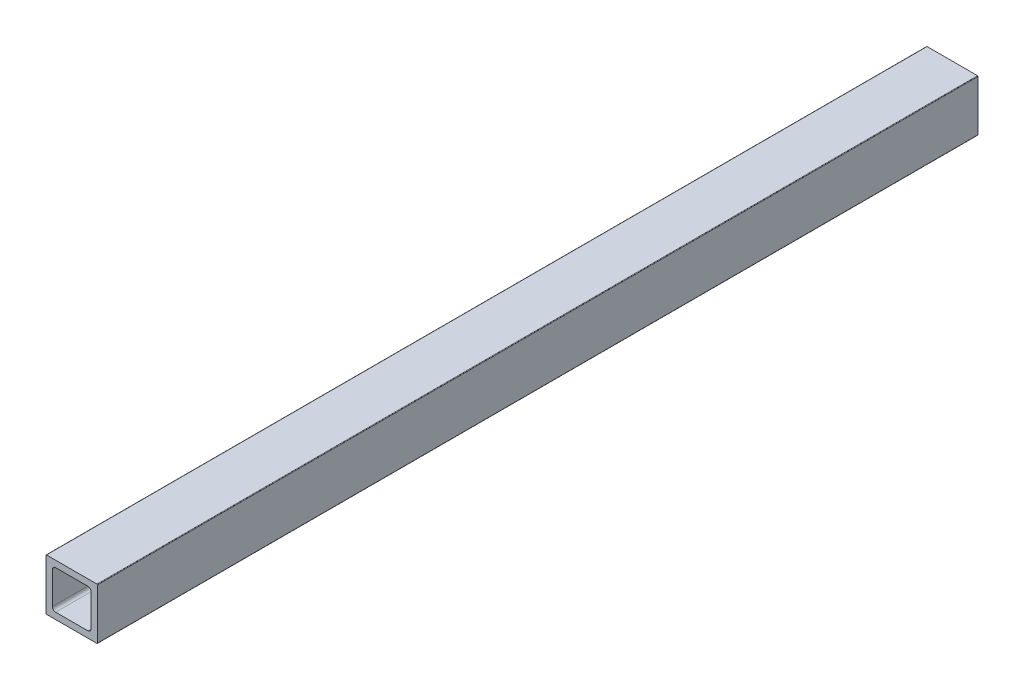
ISO-10303-21;
HEADER;
FILE_DESCRIPTION(('STEP AP214'),'2;1');
FILE_NAME('part.step','',(''),(''),'','','');
FILE_SCHEMA(('AUTOMOTIVE_DESIGN { 1 0 10303 214 1 1 1 1 }'));
ENDSEC;
DATA;
#1=APPLICATION_CONTEXT('core data for automotive mechanical design processes');
#2=APPLICATION_PROTOCOL_DEFINITION('international standard','automotive_design',2000,#1);
#3=PRODUCT_CONTEXT('',#1,'mechanical');
#4=PRODUCT('Part','Part','',(#3));
#5=PRODUCT_RELATED_PRODUCT_CATEGORY('part','',(#4));
#6=PRODUCT_DEFINITION_FORMATION('','',#4);
#7=PRODUCT_DEFINITION_CONTEXT('part definition',#1,'design');
#8=PRODUCT_DEFINITION('design','',#6,#7);
#9=PRODUCT_DEFINITION_SHAPE('','',#8);
#10=(LENGTH_UNIT() NAMED_UNIT(*) SI_UNIT(.MILLI.,.METRE.));
#11=(NAMED_UNIT(*) PLANE_ANGLE_UNIT() SI_UNIT($,.RADIAN.));
#12=(NAMED_UNIT(*) SI_UNIT($,.STERADIAN.) SOLID_ANGLE_UNIT());
#13=UNCERTAINTY_MEASURE_WITH_UNIT(LENGTH_MEASURE(1.E-05),#10,'distance_accuracy_value','');
#14=(GEOMETRIC_REPRESENTATION_CONTEXT(3) GLOBAL_UNCERTAINTY_ASSIGNED_CONTEXT((#13)) GLOBAL_UNIT_ASSIGNED_CONTEXT((#10,
#11,#12)) REPRESENTATION_CONTEXT('',''));
#15=CARTESIAN_POINT('',(0.,0.,0.));
#16=DIRECTION('',(0.,0.,1.));
#17=DIRECTION('',(1.,0.,0.));
#18=AXIS2_PLACEMENT_3D('',#15,#16,#17);
#19=CARTESIAN_POINT('',(0.254,0.254,0.));
#20=DIRECTION('',(0.,0.,-1.));
#21=DIRECTION('',(0.,-1.,0.));
#22=AXIS2_PLACEMENT_3D('',#19,#20,#21);
#23=PLANE('',#22);
#24=CARTESIAN_POINT('',(0.254,0.254,0.));
#25=DIRECTION('',(0.,0.,1.));
#26=DIRECTION('',(-1.,0.,0.));
#27=AXIS2_PLACEMENT_3D('',#24,#25,#26);
#28=CIRCLE('',#27,0.254);
#29=CARTESIAN_POINT('',(0.,0.254,0.));
#30=VERTEX_POINT('',#29);
#31=CARTESIAN_POINT('',(0.254,0.,0.));
#32=VERTEX_POINT('',#31);
#33=EDGE_CURVE('E193',#30,#32,#28,.T.);
#34=ORIENTED_EDGE('',*,*,#33,.F.);
#35=DIRECTION('',(0.,-1.,0.));
#36=VECTOR('',#35,1.);
#37=CARTESIAN_POINT('',(0.,0.254,0.));
#38=LINE('',#37,#36);
#39=CARTESIAN_POINT('',(0.,25.146,0.));
#40=VERTEX_POINT('',#39);
#41=EDGE_CURVE('E191',#40,#30,#38,.T.);
#42=ORIENTED_EDGE('',*,*,#41,.F.);
#43=CARTESIAN_POINT('',(0.254,25.146,0.));
#44=DIRECTION('',(0.,0.,1.));
#45=DIRECTION('',(-1.,0.,0.));
#46=AXIS2_PLACEMENT_3D('',#43,#44,#45);
#47=CIRCLE('',#46,0.254);
#48=CARTESIAN_POINT('',(0.254,25.4,0.));
#49=VERTEX_POINT('',#48);
#50=EDGE_CURVE('E213',#49,#40,#47,.T.);
#51=ORIENTED_EDGE('',*,*,#50,.F.);
#52=DIRECTION('',(-1.,0.,0.));
#53=VECTOR('',#52,1.);
#54=CARTESIAN_POINT('',(0.254,25.4,0.));
#55=LINE('',#54,#53);
#56=CARTESIAN_POINT('',(25.146,25.4,0.));
#57=VERTEX_POINT('',#56);
#58=EDGE_CURVE('E204',#57,#49,#55,.T.);
#59=ORIENTED_EDGE('',*,*,#58,.F.);
#60=CARTESIAN_POINT('',(25.146,25.146,0.));
#61=DIRECTION('',(0.,0.,1.));
#62=DIRECTION('',(-1.,0.,0.));
#63=AXIS2_PLACEMENT_3D('',#60,#61,#62);
#64=CIRCLE('',#63,0.254);
#65=CARTESIAN_POINT('',(25.4,25.146,0.));
#66=VERTEX_POINT('',#65);
#67=EDGE_CURVE('E236',#66,#57,#64,.T.);
#68=ORIENTED_EDGE('',*,*,#67,.F.);
#69=DIRECTION('',(0.,1.,0.));
#70=VECTOR('',#69,1.);
#71=CARTESIAN_POINT('',(25.4,0.254,0.));
#72=LINE('',#71,#70);
#73=CARTESIAN_POINT('',(25.4,0.254,0.));
#74=VERTEX_POINT('',#73);
#75=EDGE_CURVE('E235',#74,#66,#72,.T.);
#76=ORIENTED_EDGE('',*,*,#75,.F.);
#77=CARTESIAN_POINT('',(25.146,0.254,0.));
#78=DIRECTION('',(0.,0.,1.));
#79=DIRECTION('',(1.,0.,0.));
#80=AXIS2_PLACEMENT_3D('',#77,#78,#79);
#81=CIRCLE('',#80,0.254);
#82=CARTESIAN_POINT('',(25.146,0.,0.));
#83=VERTEX_POINT('',#82);
#84=EDGE_CURVE('E206',#83,#74,#81,.T.);
#85=ORIENTED_EDGE('',*,*,#84,.F.);
#86=DIRECTION('',(1.,0.,0.));
#87=VECTOR('',#86,1.);
#88=CARTESIAN_POINT('',(0.254,0.,0.));
#89=LINE('',#88,#87);
#90=EDGE_CURVE('E194',#32,#83,#89,.T.);
#91=ORIENTED_EDGE('',*,*,#90,.F.);
#92=EDGE_LOOP('',(#34,#42,#51,#59,#68,#76,#85,#91));
#93=FACE_BOUND('',#92,.T.);
#94=DIRECTION('',(0.,-1.,0.));
#95=VECTOR('',#94,1.);
#96=CARTESIAN_POINT('',(3.175,4.7625,0.));
#97=LINE('',#96,#95);
#98=CARTESIAN_POINT('',(3.175,20.6375,0.));
#99=VERTEX_POINT('',#98);
#100=CARTESIAN_POINT('',(3.175,4.7625,0.));
#101=VERTEX_POINT('',#100);
#102=EDGE_CURVE('E52',#99,#101,#97,.T.);
#103=ORIENTED_EDGE('',*,*,#102,.T.);
#104=CARTESIAN_POINT('',(4.7625,4.7625,0.));
#105=DIRECTION('',(0.,0.,1.));
#106=DIRECTION('',(1.,0.,0.));
#107=AXIS2_PLACEMENT_3D('',#104,#105,#106);
#108=CIRCLE('',#107,1.5875);
#109=CARTESIAN_POINT('',(4.7625,3.175,0.));
#110=VERTEX_POINT('',#109);
#111=EDGE_CURVE('E266',#101,#110,#108,.T.);
#112=ORIENTED_EDGE('',*,*,#111,.T.);
#113=DIRECTION('',(1.,0.,0.));
#114=VECTOR('',#113,1.);
#115=CARTESIAN_POINT('',(4.7625,3.175,0.));
#116=LINE('',#115,#114);
#117=CARTESIAN_POINT('',(20.6375,3.175,0.));
#118=VERTEX_POINT('',#117);
#119=EDGE_CURVE('E250',#110,#118,#116,.T.);
#120=ORIENTED_EDGE('',*,*,#119,.T.);
#121=CARTESIAN_POINT('',(20.6375,4.7625,0.));
#122=DIRECTION('',(0.,0.,1.));
#123=DIRECTION('',(-1.,0.,0.));
#124=AXIS2_PLACEMENT_3D('',#121,#122,#123);
#125=CIRCLE('',#124,1.5875);
#126=CARTESIAN_POINT('',(22.225,4.7625,0.));
#127=VERTEX_POINT('',#126);
#128=EDGE_CURVE('E223',#118,#127,#125,.T.);
#129=ORIENTED_EDGE('',*,*,#128,.T.);
#130=DIRECTION('',(0.,1.,0.));
#131=VECTOR('',#130,1.);
#132=CARTESIAN_POINT('',(22.225,4.7625,0.));
#133=LINE('',#132,#131);
#134=CARTESIAN_POINT('',(22.225,20.6375,0.));
#135=VERTEX_POINT('',#134);
#136=EDGE_CURVE('E219',#127,#135,#133,.T.);
#137=ORIENTED_EDGE('',*,*,#136,.T.);
#138=CARTESIAN_POINT('',(20.6375,20.6375,0.));
#139=DIRECTION('',(0.,0.,1.));
#140=DIRECTION('',(-1.,0.,0.));
#141=AXIS2_PLACEMENT_3D('',#138,#139,#140);
#142=CIRCLE('',#141,1.5875);
#143=CARTESIAN_POINT('',(20.6375,22.225,0.));
#144=VERTEX_POINT('',#143);
#145=EDGE_CURVE('E224',#135,#144,#142,.T.);
#146=ORIENTED_EDGE('',*,*,#145,.T.);
#147=DIRECTION('',(-1.,0.,0.));
#148=VECTOR('',#147,1.);
#149=CARTESIAN_POINT('',(4.7625,22.225,0.));
#150=LINE('',#149,#148);
#151=CARTESIAN_POINT('',(4.7625,22.225,0.));
#152=VERTEX_POINT('',#151);
#153=EDGE_CURVE('E229',#144,#152,#150,.T.);
#154=ORIENTED_EDGE('',*,*,#153,.T.);
#155=CARTESIAN_POINT('',(4.7625,20.6375,0.));
#156=DIRECTION('',(0.,0.,1.));
#157=DIRECTION('',(-1.,0.,0.));
#158=AXIS2_PLACEMENT_3D('',#155,#156,#157);
#159=CIRCLE('',#158,1.5875);
#160=EDGE_CURVE('E197',#152,#99,#159,.T.);
#161=ORIENTED_EDGE('',*,*,#160,.T.);
#162=EDGE_LOOP('',(#103,#112,#120,#129,#137,#146,#154,#161));
#163=FACE_BOUND('',#162,.T.);
#164=ADVANCED_FACE('F44',(#93,#163),#23,.T.);
#165=CARTESIAN_POINT('',(0.254,0.254,1828.8));
#166=DIRECTION('',(0.,0.,-1.));
#167=DIRECTION('',(-1.,0.,0.));
#168=AXIS2_PLACEMENT_3D('',#165,#166,#167);
#169=CYLINDRICAL_SURFACE('',#168,0.254);
#170=CARTESIAN_POINT('',(0.254,0.254,434.848));
#171=DIRECTION('',(0.,0.,-1.));
#172=DIRECTION('',(-1.,0.,0.));
#173=AXIS2_PLACEMENT_3D('',#170,#171,#172);
#174=CIRCLE('',#173,0.254);
#175=CARTESIAN_POINT('',(0.,0.254,434.848));
#176=VERTEX_POINT('',#175);
#177=CARTESIAN_POINT('',(0.254,0.,434.848));
#178=VERTEX_POINT('',#177);
#179=EDGE_CURVE('E172',#176,#178,#174,.F.);
#180=ORIENTED_EDGE('',*,*,#179,.F.);
#181=DIRECTION('',(0.,0.,-1.));
#182=VECTOR('',#181,1.);
#183=CARTESIAN_POINT('',(0.,0.254,1828.8));
#184=LINE('',#183,#182);
#185=EDGE_CURVE('E183',#176,#30,#184,.T.);
#186=ORIENTED_EDGE('',*,*,#185,.T.);
#187=ORIENTED_EDGE('',*,*,#33,.T.);
#188=DIRECTION('',(0.,0.,-1.));
#189=VECTOR('',#188,1.);
#190=CARTESIAN_POINT('',(0.254,0.,1828.8));
#191=LINE('',#190,#189);
#192=EDGE_CURVE('E185',#178,#32,#191,.T.);
#193=ORIENTED_EDGE('',*,*,#192,.F.);
#194=EDGE_LOOP('',(#180,#186,#187,#193));
#195=FACE_BOUND('',#194,.T.);
#196=ADVANCED_FACE('F181',(#195),#169,.T.);
#197=CARTESIAN_POINT('',(0.254,0.,1828.8));
#198=DIRECTION('',(0.,1.,0.));
#199=DIRECTION('',(1.,0.,0.));
#200=AXIS2_PLACEMENT_3D('',#197,#198,#199);
#201=PLANE('',#200);
#202=DIRECTION('',(0.,0.,-1.));
#203=VECTOR('',#202,1.);
#204=CARTESIAN_POINT('',(25.146,0.,1828.8));
#205=LINE('',#204,#203);
#206=CARTESIAN_POINT('',(25.146,0.,434.848));
#207=VERTEX_POINT('',#206);
#208=EDGE_CURVE('E210',#207,#83,#205,.T.);
#209=ORIENTED_EDGE('',*,*,#208,.F.);
#210=DIRECTION('',(1.,0.,0.));
#211=VECTOR('',#210,1.);
#212=CARTESIAN_POINT('',(0.,0.,434.848));
#213=LINE('',#212,#211);
#214=EDGE_CURVE('E177',#178,#207,#213,.T.);
#215=ORIENTED_EDGE('',*,*,#214,.F.);
#216=ORIENTED_EDGE('',*,*,#192,.T.);
#217=ORIENTED_EDGE('',*,*,#90,.T.);
#218=EDGE_LOOP('',(#209,#215,#216,#217));
#219=FACE_BOUND('',#218,.T.);
#220=ADVANCED_FACE('F289',(#219),#201,.F.);
#221=CARTESIAN_POINT('',(25.146,0.254,1828.8));
#222=DIRECTION('',(0.,0.,-1.));
#223=DIRECTION('',(-1.,0.,0.));
#224=AXIS2_PLACEMENT_3D('',#221,#222,#223);
#225=CYLINDRICAL_SURFACE('',#224,0.254);
#226=CARTESIAN_POINT('',(25.146,0.254,434.848));
#227=DIRECTION('',(0.,0.,-1.));
#228=DIRECTION('',(-1.,0.,0.));
#229=AXIS2_PLACEMENT_3D('',#226,#227,#228);
#230=CIRCLE('',#229,0.254);
#231=CARTESIAN_POINT('',(25.4,0.254,434.848));
#232=VERTEX_POINT('',#231);
#233=EDGE_CURVE('E187',#207,#232,#230,.F.);
#234=ORIENTED_EDGE('',*,*,#233,.F.);
#235=ORIENTED_EDGE('',*,*,#208,.T.);
#236=ORIENTED_EDGE('',*,*,#84,.T.);
#237=DIRECTION('',(0.,0.,-1.));
#238=VECTOR('',#237,1.);
#239=CARTESIAN_POINT('',(25.4,0.254,1828.8));
#240=LINE('',#239,#238);
#241=EDGE_CURVE('E233',#232,#74,#240,.T.);
#242=ORIENTED_EDGE('',*,*,#241,.F.);
#243=EDGE_LOOP('',(#234,#235,#236,#242));
#244=FACE_BOUND('',#243,.T.);
#245=ADVANCED_FACE('F283',(#244),#225,.T.);
#246=CARTESIAN_POINT('',(25.4,0.254,1828.8));
#247=DIRECTION('',(-1.,0.,0.));
#248=DIRECTION('',(0.,0.,1.));
#249=AXIS2_PLACEMENT_3D('',#246,#247,#248);
#250=PLANE('',#249);
#251=DIRECTION('',(0.,0.,-1.));
#252=VECTOR('',#251,1.);
#253=CARTESIAN_POINT('',(25.4,25.146,1828.8));
#254=LINE('',#253,#252);
#255=CARTESIAN_POINT('',(25.4,25.146,434.848));
#256=VERTEX_POINT('',#255);
#257=EDGE_CURVE('E258',#256,#66,#254,.T.);
#258=ORIENTED_EDGE('',*,*,#257,.F.);
#259=DIRECTION('',(0.,1.,0.));
#260=VECTOR('',#259,1.);
#261=CARTESIAN_POINT('',(25.4,0.,434.848));
#262=LINE('',#261,#260);
#263=EDGE_CURVE('E498',#232,#256,#262,.T.);
#264=ORIENTED_EDGE('',*,*,#263,.F.);
#265=ORIENTED_EDGE('',*,*,#241,.T.);
#266=ORIENTED_EDGE('',*,*,#75,.T.);
#267=EDGE_LOOP('',(#258,#264,#265,#266));
#268=FACE_BOUND('',#267,.T.);
#269=ADVANCED_FACE('F288',(#268),#250,.F.);
#270=CARTESIAN_POINT('',(25.146,25.146,1828.8));
#271=DIRECTION('',(0.,0.,-1.));
#272=DIRECTION('',(-1.,0.,0.));
#273=AXIS2_PLACEMENT_3D('',#270,#271,#272);
#274=CYLINDRICAL_SURFACE('',#273,0.254);
#275=CARTESIAN_POINT('',(25.146,25.146,434.848));
#276=DIRECTION('',(0.,0.,-1.));
#277=DIRECTION('',(-1.,0.,0.));
#278=AXIS2_PLACEMENT_3D('',#275,#276,#277);
#279=CIRCLE('',#278,0.254);
#280=CARTESIAN_POINT('',(25.146,25.4,434.848));
#281=VERTEX_POINT('',#280);
#282=EDGE_CURVE('E492',#256,#281,#279,.F.);
#283=ORIENTED_EDGE('',*,*,#282,.F.);
#284=ORIENTED_EDGE('',*,*,#257,.T.);
#285=ORIENTED_EDGE('',*,*,#67,.T.);
#286=DIRECTION('',(0.,0.,-1.));
#287=VECTOR('',#286,1.);
#288=CARTESIAN_POINT('',(25.146,25.4,1828.8));
#289=LINE('',#288,#287);
#290=EDGE_CURVE('E227',#281,#57,#289,.T.);
#291=ORIENTED_EDGE('',*,*,#290,.F.);
#292=EDGE_LOOP('',(#283,#284,#285,#291));
#293=FACE_BOUND('',#292,.T.);
#294=ADVANCED_FACE('F46',(#293),#274,.T.);
#295=CARTESIAN_POINT('',(0.254,25.4,1828.8));
#296=DIRECTION('',(0.,-1.,0.));
#297=DIRECTION('',(0.,0.,-1.));
#298=AXIS2_PLACEMENT_3D('',#295,#296,#297);
#299=PLANE('',#298);
#300=DIRECTION('',(0.,0.,-1.));
#301=VECTOR('',#300,1.);
#302=CARTESIAN_POINT('',(0.254,25.4,1828.8));
#303=LINE('',#302,#301);
#304=CARTESIAN_POINT('',(0.254,25.4,434.848));
#305=VERTEX_POINT('',#304);
#306=EDGE_CURVE('E211',#305,#49,#303,.T.);
#307=ORIENTED_EDGE('',*,*,#306,.F.);
#308=DIRECTION('',(-1.,0.,0.));
#309=VECTOR('',#308,1.);
#310=CARTESIAN_POINT('',(0.,25.4,434.848));
#311=LINE('',#310,#309);
#312=EDGE_CURVE('E545',#281,#305,#311,.T.);
#313=ORIENTED_EDGE('',*,*,#312,.F.);
#314=ORIENTED_EDGE('',*,*,#290,.T.);
#315=ORIENTED_EDGE('',*,*,#58,.T.);
#316=EDGE_LOOP('',(#307,#313,#314,#315));
#317=FACE_BOUND('',#316,.T.);
#318=ADVANCED_FACE('F347',(#317),#299,.F.);
#319=CARTESIAN_POINT('',(0.254,25.146,1828.8));
#320=DIRECTION('',(0.,0.,-1.));
#321=DIRECTION('',(-1.,0.,0.));
#322=AXIS2_PLACEMENT_3D('',#319,#320,#321);
#323=CYLINDRICAL_SURFACE('',#322,0.254);
#324=CARTESIAN_POINT('',(0.254,25.146,434.848));
#325=DIRECTION('',(0.,0.,-1.));
#326=DIRECTION('',(-1.,0.,0.));
#327=AXIS2_PLACEMENT_3D('',#324,#325,#326);
#328=CIRCLE('',#327,0.254);
#329=CARTESIAN_POINT('',(0.,25.146,434.848));
#330=VERTEX_POINT('',#329);
#331=EDGE_CURVE('E59',#305,#330,#328,.F.);
#332=ORIENTED_EDGE('',*,*,#331,.F.);
#333=ORIENTED_EDGE('',*,*,#306,.T.);
#334=ORIENTED_EDGE('',*,*,#50,.T.);
#335=DIRECTION('',(0.,0.,-1.));
#336=VECTOR('',#335,1.);
#337=CARTESIAN_POINT('',(0.,25.146,1828.8));
#338=LINE('',#337,#336);
#339=EDGE_CURVE('E216',#330,#40,#338,.T.);
#340=ORIENTED_EDGE('',*,*,#339,.F.);
#341=EDGE_LOOP('',(#332,#333,#334,#340));
#342=FACE_BOUND('',#341,.T.);
#343=ADVANCED_FACE('F276',(#342),#323,.T.);
#344=CARTESIAN_POINT('',(0.,0.254,1828.8));
#345=DIRECTION('',(1.,0.,0.));
#346=DIRECTION('',(0.,1.,0.));
#347=AXIS2_PLACEMENT_3D('',#344,#345,#346);
#348=PLANE('',#347);
#349=ORIENTED_EDGE('',*,*,#185,.F.);
#350=DIRECTION('',(0.,-1.,0.));
#351=VECTOR('',#350,1.);
#352=CARTESIAN_POINT('',(0.,0.,434.848));
#353=LINE('',#352,#351);
#354=EDGE_CURVE('E169',#330,#176,#353,.T.);
#355=ORIENTED_EDGE('',*,*,#354,.F.);
#356=ORIENTED_EDGE('',*,*,#339,.T.);
#357=ORIENTED_EDGE('',*,*,#41,.T.);
#358=EDGE_LOOP('',(#349,#355,#356,#357));
#359=FACE_BOUND('',#358,.T.);
#360=ADVANCED_FACE('F189',(#359),#348,.F.);
#361=CARTESIAN_POINT('',(4.7625,4.7625,1828.8));
#362=DIRECTION('',(0.,0.,-1.));
#363=DIRECTION('',(-1.,0.,0.));
#364=AXIS2_PLACEMENT_3D('',#361,#362,#363);
#365=CYLINDRICAL_SURFACE('',#364,1.5875);
#366=DIRECTION('',(0.,0.,-1.));
#367=VECTOR('',#366,1.);
#368=CARTESIAN_POINT('',(3.175,4.7625,1828.8));
#369=LINE('',#368,#367);
#370=CARTESIAN_POINT('',(3.175,4.7625,434.848));
#371=VERTEX_POINT('',#370);
#372=EDGE_CURVE('E186',#371,#101,#369,.T.);
#373=ORIENTED_EDGE('',*,*,#372,.F.);
#374=CARTESIAN_POINT('',(4.7625,4.7625,434.848));
#375=DIRECTION('',(0.,0.,-1.));
#376=DIRECTION('',(-1.,0.,0.));
#377=AXIS2_PLACEMENT_3D('',#374,#375,#376);
#378=CIRCLE('',#377,1.5875);
#379=CARTESIAN_POINT('',(4.7625,3.175,434.848));
#380=VERTEX_POINT('',#379);
#381=EDGE_CURVE('E66',#371,#380,#378,.F.);
#382=ORIENTED_EDGE('',*,*,#381,.T.);
#383=DIRECTION('',(0.,0.,-1.));
#384=VECTOR('',#383,1.);
#385=CARTESIAN_POINT('',(4.7625,3.175,1828.8));
#386=LINE('',#385,#384);
#387=EDGE_CURVE('E214',#380,#110,#386,.T.);
#388=ORIENTED_EDGE('',*,*,#387,.T.);
#389=ORIENTED_EDGE('',*,*,#111,.F.);
#390=EDGE_LOOP('',(#373,#382,#388,#389));
#391=FACE_BOUND('',#390,.T.);
#392=ADVANCED_FACE('F275',(#391),#365,.F.);
#393=CARTESIAN_POINT('',(4.7625,3.175,1828.8));
#394=DIRECTION('',(0.,1.,0.));
#395=DIRECTION('',(1.,0.,0.));
#396=AXIS2_PLACEMENT_3D('',#393,#394,#395);
#397=PLANE('',#396);
#398=DIRECTION('',(-1.,0.,0.));
#399=VECTOR('',#398,1.);
#400=CARTESIAN_POINT('',(4.7625,3.175,434.848));
#401=LINE('',#400,#399);
#402=CARTESIAN_POINT('',(20.6375,3.175,434.848));
#403=VERTEX_POINT('',#402);
#404=EDGE_CURVE('E532',#403,#380,#401,.T.);
#405=ORIENTED_EDGE('',*,*,#404,.F.);
#406=DIRECTION('',(0.,0.,-1.));
#407=VECTOR('',#406,1.);
#408=CARTESIAN_POINT('',(20.6375,3.175,1828.8));
#409=LINE('',#408,#407);
#410=EDGE_CURVE('E217',#403,#118,#409,.T.);
#411=ORIENTED_EDGE('',*,*,#410,.T.);
#412=ORIENTED_EDGE('',*,*,#119,.F.);
#413=ORIENTED_EDGE('',*,*,#387,.F.);
#414=EDGE_LOOP('',(#405,#411,#412,#413));
#415=FACE_BOUND('',#414,.T.);
#416=ADVANCED_FACE('F302',(#415),#397,.T.);
#417=CARTESIAN_POINT('',(20.6375,4.7625,1828.8));
#418=DIRECTION('',(0.,0.,-1.));
#419=DIRECTION('',(-1.,0.,0.));
#420=AXIS2_PLACEMENT_3D('',#417,#418,#419);
#421=CYLINDRICAL_SURFACE('',#420,1.5875);
#422=ORIENTED_EDGE('',*,*,#410,.F.);
#423=CARTESIAN_POINT('',(20.6375,4.7625,434.848));
#424=DIRECTION('',(0.,0.,-1.));
#425=DIRECTION('',(-1.,0.,0.));
#426=AXIS2_PLACEMENT_3D('',#423,#424,#425);
#427=CIRCLE('',#426,1.5875);
#428=CARTESIAN_POINT('',(22.225,4.7625,434.848));
#429=VERTEX_POINT('',#428);
#430=EDGE_CURVE('E513',#403,#429,#427,.F.);
#431=ORIENTED_EDGE('',*,*,#430,.T.);
#432=DIRECTION('',(0.,0.,-1.));
#433=VECTOR('',#432,1.);
#434=CARTESIAN_POINT('',(22.225,4.7625,1828.8));
#435=LINE('',#434,#433);
#436=EDGE_CURVE('E254',#429,#127,#435,.T.);
#437=ORIENTED_EDGE('',*,*,#436,.T.);
#438=ORIENTED_EDGE('',*,*,#128,.F.);
#439=EDGE_LOOP('',(#422,#431,#437,#438));
#440=FACE_BOUND('',#439,.T.);
#441=ADVANCED_FACE('F297',(#440),#421,.F.);
#442=CARTESIAN_POINT('',(22.225,4.7625,1828.8));
#443=DIRECTION('',(-1.,0.,0.));
#444=DIRECTION('',(0.,0.,1.));
#445=AXIS2_PLACEMENT_3D('',#442,#443,#444);
#446=PLANE('',#445);
#447=DIRECTION('',(0.,-1.,0.));
#448=VECTOR('',#447,1.);
#449=CARTESIAN_POINT('',(22.225,4.7625,434.848));
#450=LINE('',#449,#448);
#451=CARTESIAN_POINT('',(22.225,20.6375,434.848));
#452=VERTEX_POINT('',#451);
#453=EDGE_CURVE('E535',#452,#429,#450,.T.);
#454=ORIENTED_EDGE('',*,*,#453,.F.);
#455=DIRECTION('',(0.,0.,-1.));
#456=VECTOR('',#455,1.);
#457=CARTESIAN_POINT('',(22.225,20.6375,1828.8));
#458=LINE('',#457,#456);
#459=EDGE_CURVE('E240',#452,#135,#458,.T.);
#460=ORIENTED_EDGE('',*,*,#459,.T.);
#461=ORIENTED_EDGE('',*,*,#136,.F.);
#462=ORIENTED_EDGE('',*,*,#436,.F.);
#463=EDGE_LOOP('',(#454,#460,#461,#462));
#464=FACE_BOUND('',#463,.T.);
#465=ADVANCED_FACE('F301',(#464),#446,.T.);
#466=CARTESIAN_POINT('',(20.6375,20.6375,1828.8));
#467=DIRECTION('',(0.,0.,-1.));
#468=DIRECTION('',(-1.,0.,0.));
#469=AXIS2_PLACEMENT_3D('',#466,#467,#468);
#470=CYLINDRICAL_SURFACE('',#469,1.5875);
#471=ORIENTED_EDGE('',*,*,#459,.F.);
#472=CARTESIAN_POINT('',(20.6375,20.6375,434.848));
#473=DIRECTION('',(0.,0.,-1.));
#474=DIRECTION('',(-1.,0.,0.));
#475=AXIS2_PLACEMENT_3D('',#472,#473,#474);
#476=CIRCLE('',#475,1.5875);
#477=CARTESIAN_POINT('',(20.6375,22.225,434.848));
#478=VERTEX_POINT('',#477);
#479=EDGE_CURVE('E537',#452,#478,#476,.F.);
#480=ORIENTED_EDGE('',*,*,#479,.T.);
#481=DIRECTION('',(0.,0.,-1.));
#482=VECTOR('',#481,1.);
#483=CARTESIAN_POINT('',(20.6375,22.225,1828.8));
#484=LINE('',#483,#482);
#485=EDGE_CURVE('E238',#478,#144,#484,.T.);
#486=ORIENTED_EDGE('',*,*,#485,.T.);
#487=ORIENTED_EDGE('',*,*,#145,.F.);
#488=EDGE_LOOP('',(#471,#480,#486,#487));
#489=FACE_BOUND('',#488,.T.);
#490=ADVANCED_FACE('F309',(#489),#470,.F.);
#491=CARTESIAN_POINT('',(4.7625,22.225,1828.8));
#492=DIRECTION('',(0.,-1.,0.));
#493=DIRECTION('',(0.,0.,-1.));
#494=AXIS2_PLACEMENT_3D('',#491,#492,#493);
#495=PLANE('',#494);
#496=DIRECTION('',(1.,0.,0.));
#497=VECTOR('',#496,1.);
#498=CARTESIAN_POINT('',(4.7625,22.225,434.848));
#499=LINE('',#498,#497);
#500=CARTESIAN_POINT('',(4.7625,22.225,434.848));
#501=VERTEX_POINT('',#500);
#502=EDGE_CURVE('E540',#501,#478,#499,.T.);
#503=ORIENTED_EDGE('',*,*,#502,.F.);
#504=DIRECTION('',(0.,0.,-1.));
#505=VECTOR('',#504,1.);
#506=CARTESIAN_POINT('',(4.7625,22.225,1828.8));
#507=LINE('',#506,#505);
#508=EDGE_CURVE('E241',#501,#152,#507,.T.);
#509=ORIENTED_EDGE('',*,*,#508,.T.);
#510=ORIENTED_EDGE('',*,*,#153,.F.);
#511=ORIENTED_EDGE('',*,*,#485,.F.);
#512=EDGE_LOOP('',(#503,#509,#510,#511));
#513=FACE_BOUND('',#512,.T.);
#514=ADVANCED_FACE('F313',(#513),#495,.T.);
#515=CARTESIAN_POINT('',(4.7625,20.6375,1828.8));
#516=DIRECTION('',(0.,0.,-1.));
#517=DIRECTION('',(-1.,0.,0.));
#518=AXIS2_PLACEMENT_3D('',#515,#516,#517);
#519=CYLINDRICAL_SURFACE('',#518,1.5875);
#520=ORIENTED_EDGE('',*,*,#508,.F.);
#521=CARTESIAN_POINT('',(4.7625,20.6375,434.848));
#522=DIRECTION('',(0.,0.,-1.));
#523=DIRECTION('',(-1.,0.,0.));
#524=AXIS2_PLACEMENT_3D('',#521,#522,#523);
#525=CIRCLE('',#524,1.5875);
#526=CARTESIAN_POINT('',(3.175,20.6375,434.848));
#527=VERTEX_POINT('',#526);
#528=EDGE_CURVE('E542',#501,#527,#525,.F.);
#529=ORIENTED_EDGE('',*,*,#528,.T.);
#530=DIRECTION('',(0.,0.,-1.));
#531=VECTOR('',#530,1.);
#532=CARTESIAN_POINT('',(3.175,20.6375,1828.8));
#533=LINE('',#532,#531);
#534=EDGE_CURVE('E245',#527,#99,#533,.T.);
#535=ORIENTED_EDGE('',*,*,#534,.T.);
#536=ORIENTED_EDGE('',*,*,#160,.F.);
#537=EDGE_LOOP('',(#520,#529,#535,#536));
#538=FACE_BOUND('',#537,.T.);
#539=ADVANCED_FACE('F390',(#538),#519,.F.);
#540=CARTESIAN_POINT('',(3.175,4.7625,1828.8));
#541=DIRECTION('',(1.,0.,0.));
#542=DIRECTION('',(0.,1.,0.));
#543=AXIS2_PLACEMENT_3D('',#540,#541,#542);
#544=PLANE('',#543);
#545=DIRECTION('',(0.,1.,0.));
#546=VECTOR('',#545,1.);
#547=CARTESIAN_POINT('',(3.175,4.7625,434.848));
#548=LINE('',#547,#546);
#549=EDGE_CURVE('E11',#371,#527,#548,.T.);
#550=ORIENTED_EDGE('',*,*,#549,.F.);
#551=ORIENTED_EDGE('',*,*,#372,.T.);
#552=ORIENTED_EDGE('',*,*,#102,.F.);
#553=ORIENTED_EDGE('',*,*,#534,.F.);
#554=EDGE_LOOP('',(#550,#551,#552,#553));
#555=FACE_BOUND('',#554,.T.);
#556=ADVANCED_FACE('F394',(#555),#544,.T.);
#557=CARTESIAN_POINT('',(0.,0.,434.848));
#558=DIRECTION('',(0.,0.,-1.));
#559=DIRECTION('',(-1.,0.,0.));
#560=AXIS2_PLACEMENT_3D('',#557,#558,#559);
#561=PLANE('',#560);
#562=ORIENTED_EDGE('',*,*,#179,.T.);
#563=ORIENTED_EDGE('',*,*,#214,.T.);
#564=ORIENTED_EDGE('',*,*,#233,.T.);
#565=ORIENTED_EDGE('',*,*,#263,.T.);
#566=ORIENTED_EDGE('',*,*,#282,.T.);
#567=ORIENTED_EDGE('',*,*,#312,.T.);
#568=ORIENTED_EDGE('',*,*,#331,.T.);
#569=ORIENTED_EDGE('',*,*,#354,.T.);
#570=EDGE_LOOP('',(#562,#563,#564,#565,#566,#567,#568,#569));
#571=FACE_BOUND('',#570,.T.);
#572=ORIENTED_EDGE('',*,*,#549,.T.);
#573=ORIENTED_EDGE('',*,*,#528,.F.);
#574=ORIENTED_EDGE('',*,*,#502,.T.);
#575=ORIENTED_EDGE('',*,*,#479,.F.);
#576=ORIENTED_EDGE('',*,*,#453,.T.);
#577=ORIENTED_EDGE('',*,*,#430,.F.);
#578=ORIENTED_EDGE('',*,*,#404,.T.);
#579=ORIENTED_EDGE('',*,*,#381,.F.);
#580=EDGE_LOOP('',(#572,#573,#574,#575,#576,#577,#578,#579));
#581=FACE_BOUND('',#580,.T.);
#582=ADVANCED_FACE('F171',(#571,#581),#561,.F.);
#583=CLOSED_SHELL('',(#164,#196,#220,#245,#269,#294,#318,#343,#360,#392,#416,#441,#465,#490,
#514,#539,#556,#582));
#584=MANIFOLD_SOLID_BREP('B2',#583);
#585=ADVANCED_BREP_SHAPE_REPRESENTATION('',(#18,#584),#14);
#586=SHAPE_DEFINITION_REPRESENTATION(#9,#585);
ENDSEC;
END-ISO-10303-21;
